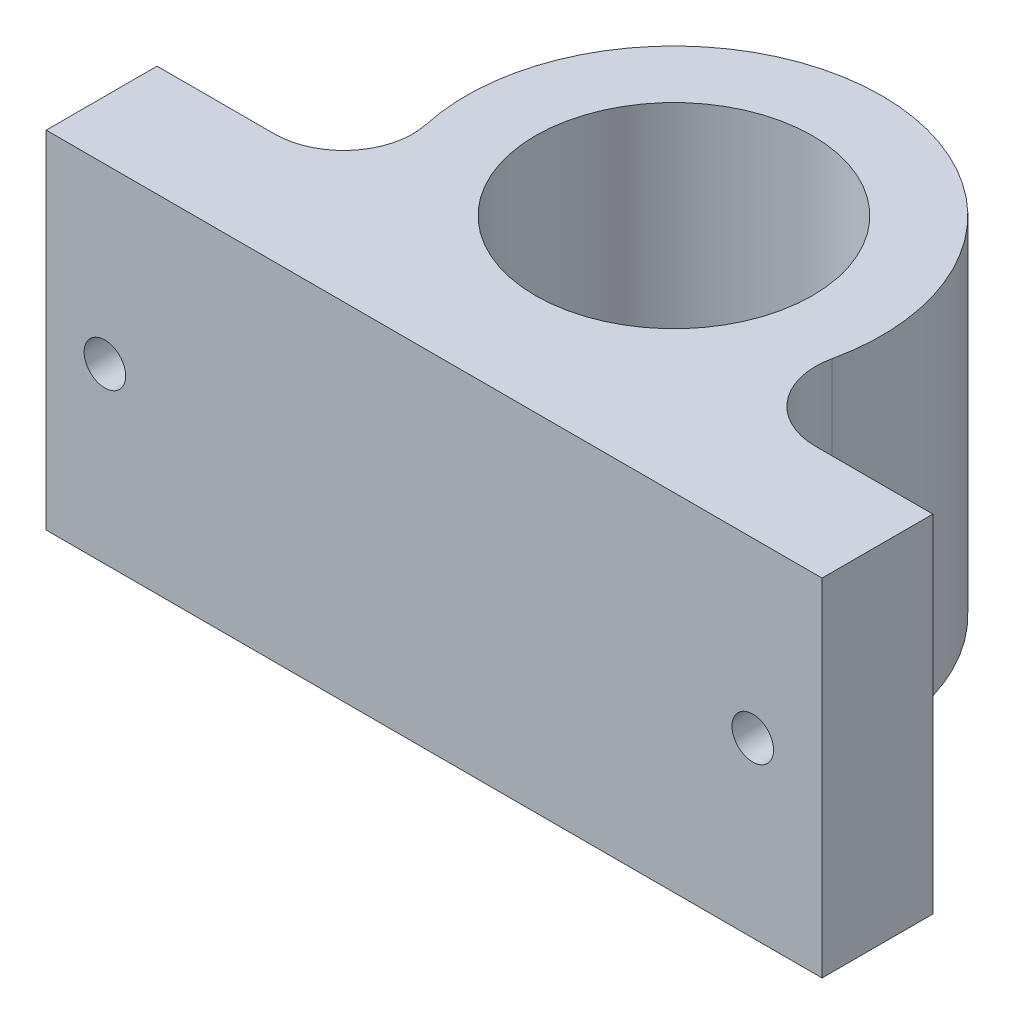
ISO-10303-21;
HEADER;
FILE_DESCRIPTION(('STEP AP214'),'2;1');
FILE_NAME('part.step','',(''),(''),'','','');
FILE_SCHEMA(('AUTOMOTIVE_DESIGN { 1 0 10303 214 1 1 1 1 }'));
ENDSEC;
DATA;
#1=APPLICATION_CONTEXT('core data for automotive mechanical design processes');
#2=APPLICATION_PROTOCOL_DEFINITION('international standard','automotive_design',2000,#1);
#3=PRODUCT_CONTEXT('',#1,'mechanical');
#4=PRODUCT('Part','Part','',(#3));
#5=PRODUCT_RELATED_PRODUCT_CATEGORY('part','',(#4));
#6=PRODUCT_DEFINITION_FORMATION('','',#4);
#7=PRODUCT_DEFINITION_CONTEXT('part definition',#1,'design');
#8=PRODUCT_DEFINITION('design','',#6,#7);
#9=PRODUCT_DEFINITION_SHAPE('','',#8);
#10=(LENGTH_UNIT() NAMED_UNIT(*) SI_UNIT(.MILLI.,.METRE.));
#11=(NAMED_UNIT(*) PLANE_ANGLE_UNIT() SI_UNIT($,.RADIAN.));
#12=(NAMED_UNIT(*) SI_UNIT($,.STERADIAN.) SOLID_ANGLE_UNIT());
#13=UNCERTAINTY_MEASURE_WITH_UNIT(LENGTH_MEASURE(1.E-05),#10,'distance_accuracy_value','');
#14=(GEOMETRIC_REPRESENTATION_CONTEXT(3) GLOBAL_UNCERTAINTY_ASSIGNED_CONTEXT((#13)) GLOBAL_UNIT_ASSIGNED_CONTEXT((#10,
#11,#12)) REPRESENTATION_CONTEXT('',''));
#15=CARTESIAN_POINT('',(0.,0.,0.));
#16=DIRECTION('',(0.,0.,1.));
#17=DIRECTION('',(1.,0.,0.));
#18=AXIS2_PLACEMENT_3D('',#15,#16,#17);
#19=CARTESIAN_POINT('',(0.,25.,-17.3101363024963));
#20=DIRECTION('',(0.,-1.,0.));
#21=DIRECTION('',(0.,0.,-1.));
#22=AXIS2_PLACEMENT_3D('',#19,#20,#21);
#23=PLANE('',#22);
#24=DIRECTION('',(0.,0.,-1.));
#25=VECTOR('',#24,1.);
#26=CARTESIAN_POINT('',(28.,25.,0.));
#27=LINE('',#26,#25);
#28=CARTESIAN_POINT('',(28.,25.,0.));
#29=VERTEX_POINT('',#28);
#30=CARTESIAN_POINT('',(28.,25.,-8.));
#31=VERTEX_POINT('',#30);
#32=EDGE_CURVE('E135',#29,#31,#27,.T.);
#33=ORIENTED_EDGE('',*,*,#32,.T.);
#34=DIRECTION('',(-1.,0.,0.));
#35=VECTOR('',#34,1.);
#36=CARTESIAN_POINT('',(28.,25.,-8.));
#37=LINE('',#36,#35);
#38=CARTESIAN_POINT('',(19.5300467243144,25.,-8.));
#39=VERTEX_POINT('',#38);
#40=EDGE_CURVE('E122',#31,#39,#37,.T.);
#41=ORIENTED_EDGE('',*,*,#40,.T.);
#42=CARTESIAN_POINT('',(19.5300467243144,25.,-13.));
#43=DIRECTION('',(0.,-1.,0.));
#44=DIRECTION('',(0.,0.,-1.));
#45=AXIS2_PLACEMENT_3D('',#42,#43,#44);
#46=CIRCLE('',#45,5.);
#47=CARTESIAN_POINT('',(14.6475350432358,25.,-14.0775340756241));
#48=VERTEX_POINT('',#47);
#49=EDGE_CURVE('E162',#39,#48,#46,.T.);
#50=ORIENTED_EDGE('',*,*,#49,.T.);
#51=CARTESIAN_POINT('',(0.,25.,-17.3101363024963));
#52=DIRECTION('',(0.,-1.,0.));
#53=DIRECTION('',(0.,0.,-1.));
#54=AXIS2_PLACEMENT_3D('',#51,#52,#53);
#55=CIRCLE('',#54,15.);
#56=CARTESIAN_POINT('',(-14.6475350432358,25.,-14.0775340756241));
#57=VERTEX_POINT('',#56);
#58=EDGE_CURVE('E134',#57,#48,#55,.T.);
#59=ORIENTED_EDGE('',*,*,#58,.F.);
#60=CARTESIAN_POINT('',(-19.5300467243144,25.,-13.));
#61=DIRECTION('',(0.,-1.,0.));
#62=DIRECTION('',(0.,0.,-1.));
#63=AXIS2_PLACEMENT_3D('',#60,#61,#62);
#64=CIRCLE('',#63,5.);
#65=CARTESIAN_POINT('',(-19.5300467243144,25.,-8.));
#66=VERTEX_POINT('',#65);
#67=EDGE_CURVE('E12',#57,#66,#64,.T.);
#68=ORIENTED_EDGE('',*,*,#67,.T.);
#69=DIRECTION('',(1.,0.,0.));
#70=VECTOR('',#69,1.);
#71=CARTESIAN_POINT('',(-28.,25.,-8.));
#72=LINE('',#71,#70);
#73=CARTESIAN_POINT('',(-28.,25.,-8.));
#74=VERTEX_POINT('',#73);
#75=EDGE_CURVE('E188',#74,#66,#72,.T.);
#76=ORIENTED_EDGE('',*,*,#75,.F.);
#77=DIRECTION('',(0.,0.,-1.));
#78=VECTOR('',#77,1.);
#79=CARTESIAN_POINT('',(-28.,25.,0.));
#80=LINE('',#79,#78);
#81=CARTESIAN_POINT('',(-28.,25.,0.));
#82=VERTEX_POINT('',#81);
#83=EDGE_CURVE('E191',#82,#74,#80,.T.);
#84=ORIENTED_EDGE('',*,*,#83,.F.);
#85=DIRECTION('',(-1.,0.,0.));
#86=VECTOR('',#85,1.);
#87=CARTESIAN_POINT('',(0.,25.,0.));
#88=LINE('',#87,#86);
#89=EDGE_CURVE('E141',#29,#82,#88,.T.);
#90=ORIENTED_EDGE('',*,*,#89,.F.);
#91=EDGE_LOOP('',(#33,#41,#50,#59,#68,#76,#84,#90));
#92=FACE_BOUND('',#91,.T.);
#93=CARTESIAN_POINT('',(0.,25.,-17.3101363024963));
#94=DIRECTION('',(0.,1.,0.));
#95=DIRECTION('',(0.,0.,1.));
#96=AXIS2_PLACEMENT_3D('',#93,#94,#95);
#97=CIRCLE('',#96,10.);
#98=CARTESIAN_POINT('',(0.,25.,-7.31013630249626));
#99=VERTEX_POINT('',#98);
#100=EDGE_CURVE('E175',#99,#99,#97,.T.);
#101=ORIENTED_EDGE('',*,*,#100,.F.);
#102=EDGE_LOOP('',(#101));
#103=FACE_BOUND('',#102,.T.);
#104=ADVANCED_FACE('F57',(#92,#103),#23,.F.);
#105=CARTESIAN_POINT('',(0.,0.,-17.3101363024963));
#106=DIRECTION('',(0.,-1.,0.));
#107=DIRECTION('',(0.,0.,-1.));
#108=AXIS2_PLACEMENT_3D('',#105,#106,#107);
#109=PLANE('',#108);
#110=DIRECTION('',(0.,0.,-1.));
#111=VECTOR('',#110,1.);
#112=CARTESIAN_POINT('',(28.,0.,0.));
#113=LINE('',#112,#111);
#114=CARTESIAN_POINT('',(28.,0.,0.));
#115=VERTEX_POINT('',#114);
#116=CARTESIAN_POINT('',(28.,0.,-8.));
#117=VERTEX_POINT('',#116);
#118=EDGE_CURVE('E149',#115,#117,#113,.T.);
#119=ORIENTED_EDGE('',*,*,#118,.F.);
#120=DIRECTION('',(1.,0.,0.));
#121=VECTOR('',#120,1.);
#122=CARTESIAN_POINT('',(0.,0.,0.));
#123=LINE('',#122,#121);
#124=CARTESIAN_POINT('',(-28.,0.,0.));
#125=VERTEX_POINT('',#124);
#126=EDGE_CURVE('E145',#125,#115,#123,.T.);
#127=ORIENTED_EDGE('',*,*,#126,.F.);
#128=DIRECTION('',(0.,0.,-1.));
#129=VECTOR('',#128,1.);
#130=CARTESIAN_POINT('',(-28.,0.,0.));
#131=LINE('',#130,#129);
#132=CARTESIAN_POINT('',(-28.,0.,-8.));
#133=VERTEX_POINT('',#132);
#134=EDGE_CURVE('E203',#125,#133,#131,.T.);
#135=ORIENTED_EDGE('',*,*,#134,.T.);
#136=DIRECTION('',(1.,0.,0.));
#137=VECTOR('',#136,1.);
#138=CARTESIAN_POINT('',(-28.,0.,-8.));
#139=LINE('',#138,#137);
#140=CARTESIAN_POINT('',(-19.5300467243144,0.,-8.));
#141=VERTEX_POINT('',#140);
#142=EDGE_CURVE('E201',#133,#141,#139,.T.);
#143=ORIENTED_EDGE('',*,*,#142,.T.);
#144=CARTESIAN_POINT('',(-19.5300467243144,0.,-13.));
#145=DIRECTION('',(0.,-1.,0.));
#146=DIRECTION('',(0.,0.,-1.));
#147=AXIS2_PLACEMENT_3D('',#144,#145,#146);
#148=CIRCLE('',#147,5.);
#149=CARTESIAN_POINT('',(-14.6475350432358,0.,-14.0775340756241));
#150=VERTEX_POINT('',#149);
#151=EDGE_CURVE('E66',#141,#150,#148,.F.);
#152=ORIENTED_EDGE('',*,*,#151,.T.);
#153=CARTESIAN_POINT('',(0.,0.,-17.3101363024963));
#154=DIRECTION('',(0.,-1.,0.));
#155=DIRECTION('',(0.,0.,-1.));
#156=AXIS2_PLACEMENT_3D('',#153,#154,#155);
#157=CIRCLE('',#156,15.);
#158=CARTESIAN_POINT('',(14.6475350432358,0.,-14.0775340756241));
#159=VERTEX_POINT('',#158);
#160=EDGE_CURVE('E199',#150,#159,#157,.T.);
#161=ORIENTED_EDGE('',*,*,#160,.T.);
#162=CARTESIAN_POINT('',(19.5300467243144,0.,-13.));
#163=DIRECTION('',(0.,-1.,0.));
#164=DIRECTION('',(0.,0.,-1.));
#165=AXIS2_PLACEMENT_3D('',#162,#163,#164);
#166=CIRCLE('',#165,5.);
#167=CARTESIAN_POINT('',(19.5300467243144,0.,-8.));
#168=VERTEX_POINT('',#167);
#169=EDGE_CURVE('E160',#159,#168,#166,.F.);
#170=ORIENTED_EDGE('',*,*,#169,.T.);
#171=DIRECTION('',(-1.,0.,0.));
#172=VECTOR('',#171,1.);
#173=CARTESIAN_POINT('',(28.,0.,-8.));
#174=LINE('',#173,#172);
#175=EDGE_CURVE('E197',#117,#168,#174,.T.);
#176=ORIENTED_EDGE('',*,*,#175,.F.);
#177=EDGE_LOOP('',(#119,#127,#135,#143,#152,#161,#170,#176));
#178=FACE_BOUND('',#177,.T.);
#179=CARTESIAN_POINT('',(0.,0.,-17.3101363024963));
#180=DIRECTION('',(0.,1.,0.));
#181=DIRECTION('',(0.,0.,1.));
#182=AXIS2_PLACEMENT_3D('',#179,#180,#181);
#183=CIRCLE('',#182,10.);
#184=CARTESIAN_POINT('',(0.,0.,-7.31013630249626));
#185=VERTEX_POINT('',#184);
#186=EDGE_CURVE('E170',#185,#185,#183,.T.);
#187=ORIENTED_EDGE('',*,*,#186,.T.);
#188=EDGE_LOOP('',(#187));
#189=FACE_BOUND('',#188,.T.);
#190=ADVANCED_FACE('F214',(#178,#189),#109,.T.);
#191=CARTESIAN_POINT('',(28.,25.,0.));
#192=DIRECTION('',(-1.,0.,0.));
#193=DIRECTION('',(0.,0.,1.));
#194=AXIS2_PLACEMENT_3D('',#191,#192,#193);
#195=PLANE('',#194);
#196=ORIENTED_EDGE('',*,*,#118,.T.);
#197=DIRECTION('',(0.,-1.,0.));
#198=VECTOR('',#197,1.);
#199=CARTESIAN_POINT('',(28.,25.,-8.));
#200=LINE('',#199,#198);
#201=EDGE_CURVE('E127',#31,#117,#200,.T.);
#202=ORIENTED_EDGE('',*,*,#201,.F.);
#203=ORIENTED_EDGE('',*,*,#32,.F.);
#204=DIRECTION('',(0.,-1.,0.));
#205=VECTOR('',#204,1.);
#206=CARTESIAN_POINT('',(28.,25.,0.));
#207=LINE('',#206,#205);
#208=EDGE_CURVE('E195',#29,#115,#207,.T.);
#209=ORIENTED_EDGE('',*,*,#208,.T.);
#210=EDGE_LOOP('',(#196,#202,#203,#209));
#211=FACE_BOUND('',#210,.T.);
#212=ADVANCED_FACE('F147',(#211),#195,.F.);
#213=CARTESIAN_POINT('',(28.,25.,-8.));
#214=DIRECTION('',(0.,0.,1.));
#215=DIRECTION('',(1.,0.,0.));
#216=AXIS2_PLACEMENT_3D('',#213,#214,#215);
#217=PLANE('',#216);
#218=CARTESIAN_POINT('',(23.,12.5,-7.99999999999999));
#219=DIRECTION('',(0.,0.,-1.));
#220=DIRECTION('',(-1.,0.,0.));
#221=AXIS2_PLACEMENT_3D('',#218,#219,#220);
#222=CIRCLE('',#221,1.5);
#223=CARTESIAN_POINT('',(21.5,12.5,-7.99999999999999));
#224=VERTEX_POINT('',#223);
#225=EDGE_CURVE('E182',#224,#224,#222,.T.);
#226=ORIENTED_EDGE('',*,*,#225,.F.);
#227=EDGE_LOOP('',(#226));
#228=FACE_BOUND('',#227,.T.);
#229=ORIENTED_EDGE('',*,*,#175,.T.);
#230=DIRECTION('',(0.,-1.,0.));
#231=VECTOR('',#230,1.);
#232=CARTESIAN_POINT('',(19.5300467243144,25.,-8.));
#233=LINE('',#232,#231);
#234=EDGE_CURVE('E130',#168,#39,#233,.F.);
#235=ORIENTED_EDGE('',*,*,#234,.T.);
#236=ORIENTED_EDGE('',*,*,#40,.F.);
#237=ORIENTED_EDGE('',*,*,#201,.T.);
#238=EDGE_LOOP('',(#229,#235,#236,#237));
#239=FACE_BOUND('',#238,.T.);
#240=ADVANCED_FACE('F125',(#228,#239),#217,.F.);
#241=CARTESIAN_POINT('',(0.,25.,-17.3101363024963));
#242=DIRECTION('',(0.,-1.,0.));
#243=DIRECTION('',(0.,0.,-1.));
#244=AXIS2_PLACEMENT_3D('',#241,#242,#243);
#245=CYLINDRICAL_SURFACE('',#244,15.);
#246=ORIENTED_EDGE('',*,*,#160,.F.);
#247=DIRECTION('',(0.,-1.,0.));
#248=VECTOR('',#247,1.);
#249=CARTESIAN_POINT('',(-14.6475350432358,25.,-14.0775340756241));
#250=LINE('',#249,#248);
#251=EDGE_CURVE('E80',#150,#57,#250,.F.);
#252=ORIENTED_EDGE('',*,*,#251,.T.);
#253=ORIENTED_EDGE('',*,*,#58,.T.);
#254=DIRECTION('',(0.,-1.,0.));
#255=VECTOR('',#254,1.);
#256=CARTESIAN_POINT('',(14.6475350432358,25.,-14.0775340756241));
#257=LINE('',#256,#255);
#258=EDGE_CURVE('E150',#48,#159,#257,.T.);
#259=ORIENTED_EDGE('',*,*,#258,.T.);
#260=EDGE_LOOP('',(#246,#252,#253,#259));
#261=FACE_BOUND('',#260,.T.);
#262=ADVANCED_FACE('F227',(#261),#245,.T.);
#263=CARTESIAN_POINT('',(-28.,25.,-8.));
#264=DIRECTION('',(0.,0.,-1.));
#265=DIRECTION('',(-1.,0.,0.));
#266=AXIS2_PLACEMENT_3D('',#263,#264,#265);
#267=PLANE('',#266);
#268=CARTESIAN_POINT('',(-23.7650233621572,12.5,-8.));
#269=DIRECTION('',(0.,0.,-1.));
#270=DIRECTION('',(-1.,0.,0.));
#271=AXIS2_PLACEMENT_3D('',#268,#269,#270);
#272=CIRCLE('',#271,1.5);
#273=CARTESIAN_POINT('',(-25.2650233621572,12.5,-8.));
#274=VERTEX_POINT('',#273);
#275=EDGE_CURVE('E171',#274,#274,#272,.T.);
#276=ORIENTED_EDGE('',*,*,#275,.F.);
#277=EDGE_LOOP('',(#276));
#278=FACE_BOUND('',#277,.T.);
#279=ORIENTED_EDGE('',*,*,#75,.T.);
#280=DIRECTION('',(0.,1.,0.));
#281=VECTOR('',#280,1.);
#282=CARTESIAN_POINT('',(-19.5300467243144,0.,-8.));
#283=LINE('',#282,#281);
#284=EDGE_CURVE('E164',#66,#141,#283,.F.);
#285=ORIENTED_EDGE('',*,*,#284,.T.);
#286=ORIENTED_EDGE('',*,*,#142,.F.);
#287=DIRECTION('',(0.,-1.,0.));
#288=VECTOR('',#287,1.);
#289=CARTESIAN_POINT('',(-28.,25.,-8.));
#290=LINE('',#289,#288);
#291=EDGE_CURVE('E151',#74,#133,#290,.T.);
#292=ORIENTED_EDGE('',*,*,#291,.F.);
#293=EDGE_LOOP('',(#279,#285,#286,#292));
#294=FACE_BOUND('',#293,.T.);
#295=ADVANCED_FACE('F225',(#278,#294),#267,.T.);
#296=CARTESIAN_POINT('',(-28.,25.,0.));
#297=DIRECTION('',(-1.,0.,0.));
#298=DIRECTION('',(0.,0.,1.));
#299=AXIS2_PLACEMENT_3D('',#296,#297,#298);
#300=PLANE('',#299);
#301=ORIENTED_EDGE('',*,*,#134,.F.);
#302=DIRECTION('',(0.,-1.,0.));
#303=VECTOR('',#302,1.);
#304=CARTESIAN_POINT('',(-28.,25.,0.));
#305=LINE('',#304,#303);
#306=EDGE_CURVE('E155',#82,#125,#305,.T.);
#307=ORIENTED_EDGE('',*,*,#306,.F.);
#308=ORIENTED_EDGE('',*,*,#83,.T.);
#309=ORIENTED_EDGE('',*,*,#291,.T.);
#310=EDGE_LOOP('',(#301,#307,#308,#309));
#311=FACE_BOUND('',#310,.T.);
#312=ADVANCED_FACE('F212',(#311),#300,.T.);
#313=CARTESIAN_POINT('',(0.,25.,0.));
#314=DIRECTION('',(0.,0.,-1.));
#315=DIRECTION('',(-1.,0.,0.));
#316=AXIS2_PLACEMENT_3D('',#313,#314,#315);
#317=PLANE('',#316);
#318=CARTESIAN_POINT('',(23.,12.5,0.));
#319=DIRECTION('',(0.,0.,-1.));
#320=DIRECTION('',(-1.,0.,0.));
#321=AXIS2_PLACEMENT_3D('',#318,#319,#320);
#322=CIRCLE('',#321,1.5);
#323=CARTESIAN_POINT('',(21.5,12.5,0.));
#324=VERTEX_POINT('',#323);
#325=EDGE_CURVE('E61',#324,#324,#322,.T.);
#326=ORIENTED_EDGE('',*,*,#325,.T.);
#327=EDGE_LOOP('',(#326));
#328=FACE_BOUND('',#327,.T.);
#329=CARTESIAN_POINT('',(-23.7650233621572,12.5,0.));
#330=DIRECTION('',(0.,0.,-1.));
#331=DIRECTION('',(-1.,0.,0.));
#332=AXIS2_PLACEMENT_3D('',#329,#330,#331);
#333=CIRCLE('',#332,1.5);
#334=CARTESIAN_POINT('',(-25.2650233621572,12.5,0.));
#335=VERTEX_POINT('',#334);
#336=EDGE_CURVE('E168',#335,#335,#333,.T.);
#337=ORIENTED_EDGE('',*,*,#336,.T.);
#338=EDGE_LOOP('',(#337));
#339=FACE_BOUND('',#338,.T.);
#340=ORIENTED_EDGE('',*,*,#126,.T.);
#341=ORIENTED_EDGE('',*,*,#208,.F.);
#342=ORIENTED_EDGE('',*,*,#89,.T.);
#343=ORIENTED_EDGE('',*,*,#306,.T.);
#344=EDGE_LOOP('',(#340,#341,#342,#343));
#345=FACE_BOUND('',#344,.T.);
#346=ADVANCED_FACE('F210',(#328,#339,#345),#317,.F.);
#347=CARTESIAN_POINT('',(0.,25.,-17.3101363024963));
#348=DIRECTION('',(0.,-1.,0.));
#349=DIRECTION('',(0.,0.,-1.));
#350=AXIS2_PLACEMENT_3D('',#347,#348,#349);
#351=CYLINDRICAL_SURFACE('',#350,10.);
#352=ORIENTED_EDGE('',*,*,#100,.T.);
#353=EDGE_LOOP('',(#352));
#354=FACE_BOUND('',#353,.T.);
#355=ORIENTED_EDGE('',*,*,#186,.F.);
#356=EDGE_LOOP('',(#355));
#357=FACE_BOUND('',#356,.T.);
#358=ADVANCED_FACE('F243',(#354,#357),#351,.F.);
#359=CARTESIAN_POINT('',(19.5300467243144,25.,-13.));
#360=DIRECTION('',(0.,-1.,0.));
#361=DIRECTION('',(0.,0.,-1.));
#362=AXIS2_PLACEMENT_3D('',#359,#360,#361);
#363=CYLINDRICAL_SURFACE('',#362,5.);
#364=ORIENTED_EDGE('',*,*,#49,.F.);
#365=ORIENTED_EDGE('',*,*,#234,.F.);
#366=ORIENTED_EDGE('',*,*,#169,.F.);
#367=ORIENTED_EDGE('',*,*,#258,.F.);
#368=EDGE_LOOP('',(#364,#365,#366,#367));
#369=FACE_BOUND('',#368,.T.);
#370=ADVANCED_FACE('F218',(#369),#363,.F.);
#371=CARTESIAN_POINT('',(-19.5300467243144,25.,-13.));
#372=DIRECTION('',(0.,-1.,0.));
#373=DIRECTION('',(0.,0.,-1.));
#374=AXIS2_PLACEMENT_3D('',#371,#372,#373);
#375=CYLINDRICAL_SURFACE('',#374,5.);
#376=ORIENTED_EDGE('',*,*,#67,.F.);
#377=ORIENTED_EDGE('',*,*,#251,.F.);
#378=ORIENTED_EDGE('',*,*,#151,.F.);
#379=ORIENTED_EDGE('',*,*,#284,.F.);
#380=EDGE_LOOP('',(#376,#377,#378,#379));
#381=FACE_BOUND('',#380,.T.);
#382=ADVANCED_FACE('F59',(#381),#375,.F.);
#383=CARTESIAN_POINT('',(-23.7650233621572,12.5,-8.));
#384=DIRECTION('',(0.,0.,-1.));
#385=DIRECTION('',(-1.,0.,0.));
#386=AXIS2_PLACEMENT_3D('',#383,#384,#385);
#387=CYLINDRICAL_SURFACE('',#386,1.5);
#388=ORIENTED_EDGE('',*,*,#275,.T.);
#389=EDGE_LOOP('',(#388));
#390=FACE_BOUND('',#389,.T.);
#391=ORIENTED_EDGE('',*,*,#336,.F.);
#392=EDGE_LOOP('',(#391));
#393=FACE_BOUND('',#392,.T.);
#394=ADVANCED_FACE('F256',(#390,#393),#387,.F.);
#395=CARTESIAN_POINT('',(23.,12.5,-7.99999999999999));
#396=DIRECTION('',(0.,0.,-1.));
#397=DIRECTION('',(-1.,0.,0.));
#398=AXIS2_PLACEMENT_3D('',#395,#396,#397);
#399=CYLINDRICAL_SURFACE('',#398,1.5);
#400=ORIENTED_EDGE('',*,*,#225,.T.);
#401=EDGE_LOOP('',(#400));
#402=FACE_BOUND('',#401,.T.);
#403=ORIENTED_EDGE('',*,*,#325,.F.);
#404=EDGE_LOOP('',(#403));
#405=FACE_BOUND('',#404,.T.);
#406=ADVANCED_FACE('F254',(#402,#405),#399,.F.);
#407=CLOSED_SHELL('',(#104,#190,#212,#240,#262,#295,#312,#346,#358,#370,#382,#394,#406));
#408=MANIFOLD_SOLID_BREP('B2',#407);
#409=ADVANCED_BREP_SHAPE_REPRESENTATION('',(#18,#408),#14);
#410=SHAPE_DEFINITION_REPRESENTATION(#9,#409);
ENDSEC;
END-ISO-10303-21;
